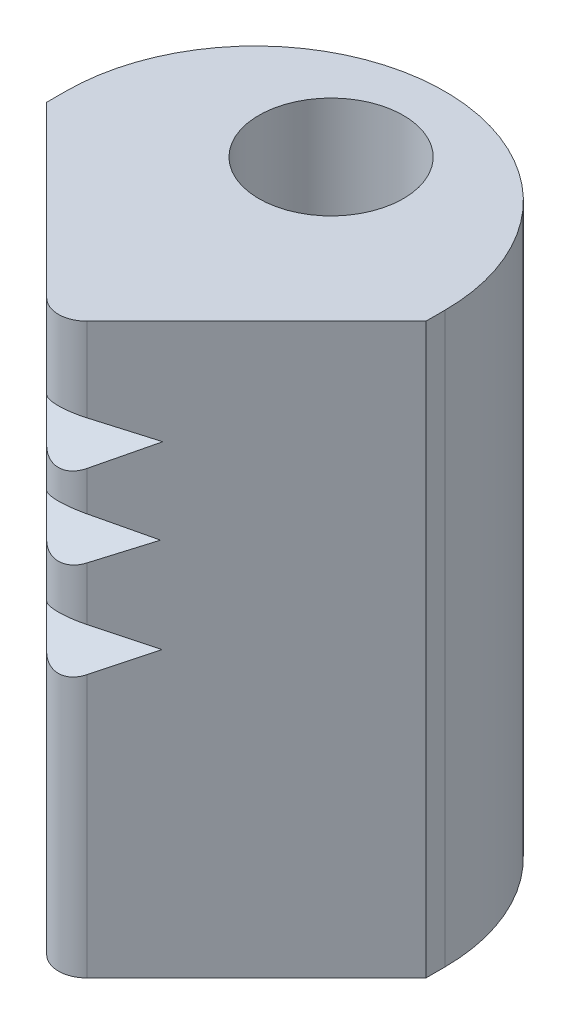
ISO-10303-21;
HEADER;
FILE_DESCRIPTION(('STEP AP214'),'2;1');
FILE_NAME('part.step','',(''),(''),'','','');
FILE_SCHEMA(('AUTOMOTIVE_DESIGN { 1 0 10303 214 1 1 1 1 }'));
ENDSEC;
DATA;
#1=APPLICATION_CONTEXT('core data for automotive mechanical design processes');
#2=APPLICATION_PROTOCOL_DEFINITION('international standard','automotive_design',2000,#1);
#3=PRODUCT_CONTEXT('',#1,'mechanical');
#4=PRODUCT('Part','Part','',(#3));
#5=PRODUCT_RELATED_PRODUCT_CATEGORY('part','',(#4));
#6=PRODUCT_DEFINITION_FORMATION('','',#4);
#7=PRODUCT_DEFINITION_CONTEXT('part definition',#1,'design');
#8=PRODUCT_DEFINITION('design','',#6,#7);
#9=PRODUCT_DEFINITION_SHAPE('','',#8);
#10=(LENGTH_UNIT() NAMED_UNIT(*) SI_UNIT(.MILLI.,.METRE.));
#11=(NAMED_UNIT(*) PLANE_ANGLE_UNIT() SI_UNIT($,.RADIAN.));
#12=(NAMED_UNIT(*) SI_UNIT($,.STERADIAN.) SOLID_ANGLE_UNIT());
#13=UNCERTAINTY_MEASURE_WITH_UNIT(LENGTH_MEASURE(1.E-05),#10,'distance_accuracy_value','');
#14=(GEOMETRIC_REPRESENTATION_CONTEXT(3) GLOBAL_UNCERTAINTY_ASSIGNED_CONTEXT((#13)) GLOBAL_UNIT_ASSIGNED_CONTEXT((#10,
#11,#12)) REPRESENTATION_CONTEXT('',''));
#15=CARTESIAN_POINT('',(0.,0.,0.));
#16=DIRECTION('',(0.,0.,1.));
#17=DIRECTION('',(1.,0.,0.));
#18=AXIS2_PLACEMENT_3D('',#15,#16,#17);
#19=CARTESIAN_POINT('',(-10.,15.,11.9535831344691));
#20=DIRECTION('',(0.,0.866025403784439,-0.5));
#21=DIRECTION('',(0.,0.5,0.866025403784439));
#22=AXIS2_PLACEMENT_3D('',#19,#20,#21);
#23=PLANE('',#22);
#24=DIRECTION('',(0.654653670707977,0.377964473009227,0.654653670707977));
#25=VECTOR('',#24,1.);
#26=CARTESIAN_POINT('',(-9.37234617437055,11.3477230106669,5.62765382562945));
#27=LINE('',#26,#25);
#28=CARTESIAN_POINT('',(-3.04641686553092,15.,11.9535831344691));
#29=VERTEX_POINT('',#28);
#30=CARTESIAN_POINT('',(-1.06066017177982,16.1464771616823,13.9393398282202));
#31=VERTEX_POINT('',#30);
#32=EDGE_CURVE('E36',#29,#31,#27,.T.);
#33=ORIENTED_EDGE('',*,*,#32,.F.);
#34=DIRECTION('',(1.,0.,0.));
#35=VECTOR('',#34,1.);
#36=CARTESIAN_POINT('',(-10.,15.,11.9535831344691));
#37=LINE('',#36,#35);
#38=CARTESIAN_POINT('',(3.04641686553093,15.,11.9535831344691));
#39=VERTEX_POINT('',#38);
#40=EDGE_CURVE('E11',#29,#39,#37,.T.);
#41=ORIENTED_EDGE('',*,*,#40,.T.);
#42=DIRECTION('',(0.654653670707977,-0.377964473009228,-0.654653670707977));
#43=VECTOR('',#42,1.);
#44=CARTESIAN_POINT('',(1.25548624799048,16.0339942741369,13.7445137520095));
#45=LINE('',#44,#43);
#46=CARTESIAN_POINT('',(1.06066017177982,16.1464771616823,13.9393398282202));
#47=VERTEX_POINT('',#46);
#48=EDGE_CURVE('E247',#47,#39,#45,.T.);
#49=ORIENTED_EDGE('',*,*,#48,.F.);
#50=CARTESIAN_POINT('',(0.,15.5341047259865,12.8786796564404));
#51=DIRECTION('',(0.,0.866025403784439,-0.5));
#52=DIRECTION('',(0.,0.5,0.866025403784439));
#53=AXIS2_PLACEMENT_3D('',#50,#51,#52);
#54=ELLIPSE('',#53,1.73205080756887,1.5);
#55=EDGE_CURVE('E226',#31,#47,#54,.T.);
#56=ORIENTED_EDGE('',*,*,#55,.F.);
#57=EDGE_LOOP('',(#33,#41,#49,#56));
#58=FACE_BOUND('',#57,.T.);
#59=ADVANCED_FACE('F17',(#58),#23,.F.);
#60=CARTESIAN_POINT('',(-10.,13.2802842574765,14.9322181750957));
#61=DIRECTION('',(0.,-0.866025403784439,-0.5));
#62=DIRECTION('',(0.,0.5,-0.866025403784439));
#63=AXIS2_PLACEMENT_3D('',#60,#61,#62);
#64=PLANE('',#63);
#65=DIRECTION('',(-0.654653670707977,0.377964473009228,-0.654653670707977));
#66=VECTOR('',#65,1.);
#67=CARTESIAN_POINT('',(-4.80977014654392,16.0180724914692,10.1902298534561));
#68=LINE('',#67,#66);
#69=CARTESIAN_POINT('',(-1.06066017177982,13.8535228383177,13.9393398282202));
#70=VERTEX_POINT('',#69);
#71=EDGE_CURVE('E167',#70,#29,#68,.T.);
#72=ORIENTED_EDGE('',*,*,#71,.F.);
#73=CARTESIAN_POINT('',(0.,14.4658952740135,12.8786796564404));
#74=DIRECTION('',(0.,-0.866025403784439,-0.5));
#75=DIRECTION('',(0.,-0.5,0.866025403784439));
#76=AXIS2_PLACEMENT_3D('',#73,#74,#75);
#77=ELLIPSE('',#76,1.73205080756887,1.5);
#78=CARTESIAN_POINT('',(1.06066017177982,13.8535228383177,13.9393398282202));
#79=VERTEX_POINT('',#78);
#80=EDGE_CURVE('E273',#79,#70,#77,.T.);
#81=ORIENTED_EDGE('',*,*,#80,.F.);
#82=DIRECTION('',(-0.654653670707977,-0.377964473009228,0.654653670707977));
#83=VECTOR('',#82,1.);
#84=CARTESIAN_POINT('',(-3.30708977983616,11.3318012279992,18.3070897798362));
#85=LINE('',#84,#83);
#86=EDGE_CURVE('E231',#39,#79,#85,.T.);
#87=ORIENTED_EDGE('',*,*,#86,.F.);
#88=ORIENTED_EDGE('',*,*,#40,.F.);
#89=EDGE_LOOP('',(#72,#81,#87,#88));
#90=FACE_BOUND('',#89,.T.);
#91=ADVANCED_FACE('F19',(#90),#64,.F.);
#92=CARTESIAN_POINT('',(-10.,20.0000002980232,12.0000001788139));
#93=DIRECTION('',(0.,0.850328406941422,-0.526252411251923));
#94=DIRECTION('',(0.,0.526252411251923,0.850328406941422));
#95=AXIS2_PLACEMENT_3D('',#92,#93,#94);
#96=PLANE('',#95);
#97=DIRECTION('',(0.647793653966395,0.400907425426037,0.647793653966395));
#98=VECTOR('',#97,1.);
#99=CARTESIAN_POINT('',(-10.0032373228813,15.665827063598,4.9967626771187));
#100=LINE('',#99,#98);
#101=CARTESIAN_POINT('',(-2.99999982118607,20.0000002980232,12.0000001788139));
#102=VERTEX_POINT('',#101);
#103=CARTESIAN_POINT('',(-1.06066017177982,21.2002214812805,13.9393398282202));
#104=VERTEX_POINT('',#103);
#105=EDGE_CURVE('E125',#102,#104,#100,.T.);
#106=ORIENTED_EDGE('',*,*,#105,.F.);
#107=DIRECTION('',(1.,0.,0.));
#108=VECTOR('',#107,1.);
#109=CARTESIAN_POINT('',(-10.,20.0000002980232,12.0000001788139));
#110=LINE('',#109,#108);
#111=CARTESIAN_POINT('',(2.99999982118607,20.0000002980232,12.0000001788139));
#112=VERTEX_POINT('',#111);
#113=EDGE_CURVE('E28',#102,#112,#110,.T.);
#114=ORIENTED_EDGE('',*,*,#113,.T.);
#115=DIRECTION('',(0.647793653966395,-0.400907425426037,-0.647793653966395));
#116=VECTOR('',#115,1.);
#117=CARTESIAN_POINT('',(2.05559680795799,20.5844737306968,12.944403192042));
#118=LINE('',#117,#116);
#119=CARTESIAN_POINT('',(1.06066017177982,21.2002214812805,13.9393398282202));
#120=VERTEX_POINT('',#119);
#121=EDGE_CURVE('E139',#120,#112,#118,.T.);
#122=ORIENTED_EDGE('',*,*,#121,.F.);
#123=CARTESIAN_POINT('',(0.,20.5437986588021,12.8786796564404));
#124=DIRECTION('',(0.,0.850328406941422,-0.526252411251923));
#125=DIRECTION('',(0.,0.526252411251923,0.850328406941422));
#126=AXIS2_PLACEMENT_3D('',#123,#124,#125);
#127=ELLIPSE('',#126,1.76402433195829,1.5);
#128=EDGE_CURVE('E137',#104,#120,#127,.T.);
#129=ORIENTED_EDGE('',*,*,#128,.F.);
#130=EDGE_LOOP('',(#106,#114,#122,#129));
#131=FACE_BOUND('',#130,.T.);
#132=ADVANCED_FACE('F138',(#131),#96,.F.);
#133=CARTESIAN_POINT('',(-10.,18.4094929619204,14.9603996389794));
#134=DIRECTION('',(0.,-0.880912160417692,-0.473279796344862));
#135=DIRECTION('',(0.,0.473279796344862,-0.880912160417692));
#136=AXIS2_PLACEMENT_3D('',#133,#134,#135);
#137=PLANE('',#136);
#138=DIRECTION('',(-0.661013550145006,0.355136837077472,-0.661013550145006));
#139=VECTOR('',#138,1.);
#140=CARTESIAN_POINT('',(-4.40691301195997,20.7558799626752,10.59308698804));
#141=LINE('',#140,#139);
#142=CARTESIAN_POINT('',(-1.06066017177982,18.9580686326921,13.9393398282202));
#143=VERTEX_POINT('',#142);
#144=EDGE_CURVE('E119',#143,#102,#141,.T.);
#145=ORIENTED_EDGE('',*,*,#144,.F.);
#146=CARTESIAN_POINT('',(0.,19.5279200351894,12.8786796564404));
#147=DIRECTION('',(0.,-0.880912160417692,-0.473279796344862));
#148=DIRECTION('',(0.,-0.473279796344862,0.880912160417692));
#149=AXIS2_PLACEMENT_3D('',#146,#147,#148);
#150=ELLIPSE('',#149,1.70278044440749,1.5);
#151=CARTESIAN_POINT('',(1.06066017177982,18.9580686326921,13.9393398282202));
#152=VERTEX_POINT('',#151);
#153=EDGE_CURVE('E227',#152,#143,#150,.T.);
#154=ORIENTED_EDGE('',*,*,#153,.F.);
#155=DIRECTION('',(-0.661013550145006,-0.355136837077473,0.661013550145006));
#156=VECTOR('',#155,1.);
#157=CARTESIAN_POINT('',(-3.86842155452211,16.3098649860479,18.8684215545221));
#158=LINE('',#157,#156);
#159=EDGE_CURVE('E215',#112,#152,#158,.T.);
#160=ORIENTED_EDGE('',*,*,#159,.F.);
#161=ORIENTED_EDGE('',*,*,#113,.F.);
#162=EDGE_LOOP('',(#145,#154,#160,#161));
#163=FACE_BOUND('',#162,.T.);
#164=ADVANCED_FACE('F322',(#163),#137,.F.);
#165=CARTESIAN_POINT('',(-10.,24.495302072441,11.939961089278));
#166=DIRECTION('',(0.,0.878217976496904,-0.478260583529192));
#167=DIRECTION('',(0.,0.478260583529192,0.878217976496904));
#168=AXIS2_PLACEMENT_3D('',#165,#166,#167);
#169=PLANE('',#168);
#170=DIRECTION('',(0.659872955749197,0.359354093536773,0.659872955749197));
#171=VECTOR('',#170,1.);
#172=CARTESIAN_POINT('',(-10.4971255049263,20.4452080530848,4.50287449507367));
#173=LINE('',#172,#171);
#174=CARTESIAN_POINT('',(-3.06003891072198,24.495302072441,11.939961089278));
#175=VERTEX_POINT('',#174);
#176=CARTESIAN_POINT('',(-1.06066017177982,25.5841251983313,13.9393398282202));
#177=VERTEX_POINT('',#176);
#178=EDGE_CURVE('E157',#175,#177,#173,.T.);
#179=ORIENTED_EDGE('',*,*,#178,.F.);
#180=DIRECTION('',(1.,0.,0.));
#181=VECTOR('',#180,1.);
#182=CARTESIAN_POINT('',(-10.,24.495302072441,11.939961089278));
#183=LINE('',#182,#181);
#184=CARTESIAN_POINT('',(3.06003891072198,24.495302072441,11.939961089278));
#185=VERTEX_POINT('',#184);
#186=EDGE_CURVE('E174',#175,#185,#183,.T.);
#187=ORIENTED_EDGE('',*,*,#186,.T.);
#188=DIRECTION('',(0.659872955749197,-0.359354093536773,-0.659872955749197));
#189=VECTOR('',#188,1.);
#190=CARTESIAN_POINT('',(2.25032486726381,24.9362567343586,12.7496751327362));
#191=LINE('',#190,#189);
#192=CARTESIAN_POINT('',(1.06066017177982,25.5841251983313,13.9393398282202));
#193=VERTEX_POINT('',#192);
#194=EDGE_CURVE('E249',#193,#185,#191,.T.);
#195=ORIENTED_EDGE('',*,*,#194,.F.);
#196=CARTESIAN_POINT('',(0.,25.0065101115791,12.8786796564404));
#197=DIRECTION('',(0.,0.878217976496904,-0.478260583529192));
#198=DIRECTION('',(0.,0.478260583529192,0.878217976496904));
#199=AXIS2_PLACEMENT_3D('',#196,#197,#198);
#200=ELLIPSE('',#199,1.70800420868552,1.5);
#201=EDGE_CURVE('E171',#177,#193,#200,.T.);
#202=ORIENTED_EDGE('',*,*,#201,.F.);
#203=EDGE_LOOP('',(#179,#187,#195,#202));
#204=FACE_BOUND('',#203,.T.);
#205=ADVANCED_FACE('F342',(#204),#169,.F.);
#206=CARTESIAN_POINT('',(-10.,22.6890197728805,14.8958609952786));
#207=DIRECTION('',(0.,-0.853294803213502,-0.521428785941888));
#208=DIRECTION('',(0.,0.521428785941888,-0.853294803213502));
#209=AXIS2_PLACEMENT_3D('',#206,#207,#208);
#210=PLANE('',#209);
#211=DIRECTION('',(-0.649102310529465,0.39665146026533,-0.649102310529465));
#212=VECTOR('',#211,1.);
#213=CARTESIAN_POINT('',(-3.43748899209079,24.7259531170046,11.5625110079092));
#214=LINE('',#213,#212);
#215=CARTESIAN_POINT('',(-1.06066017177982,23.2735278104176,13.9393398282202));
#216=VERTEX_POINT('',#215);
#217=EDGE_CURVE('E152',#216,#175,#214,.T.);
#218=ORIENTED_EDGE('',*,*,#217,.F.);
#219=CARTESIAN_POINT('',(0.,23.9216727933535,12.8786796564404));
#220=DIRECTION('',(0.,-0.853294803213502,-0.521428785941888));
#221=DIRECTION('',(0.,-0.521428785941888,0.853294803213502));
#222=AXIS2_PLACEMENT_3D('',#219,#220,#221);
#223=ELLIPSE('',#222,1.75789187318499,1.5);
#224=CARTESIAN_POINT('',(1.06066017177982,23.2735278104176,13.9393398282202));
#225=VERTEX_POINT('',#224);
#226=EDGE_CURVE('E150',#225,#216,#223,.T.);
#227=ORIENTED_EDGE('',*,*,#226,.F.);
#228=DIRECTION('',(-0.649102310529465,-0.39665146026533,0.649102310529465));
#229=VECTOR('',#228,1.);
#230=CARTESIAN_POINT('',(-4.5422952078053,19.8496909251335,19.5422952078053));
#231=LINE('',#230,#229);
#232=EDGE_CURVE('E282',#185,#225,#231,.T.);
#233=ORIENTED_EDGE('',*,*,#232,.F.);
#234=ORIENTED_EDGE('',*,*,#186,.F.);
#235=EDGE_LOOP('',(#218,#227,#233,#234));
#236=FACE_BOUND('',#235,.T.);
#237=ADVANCED_FACE('F345',(#236),#210,.F.);
#238=CARTESIAN_POINT('',(0.,0.,12.8786796564404));
#239=DIRECTION('',(0.,-1.,0.));
#240=DIRECTION('',(-0.707106781186548,0.,0.707106781186547));
#241=AXIS2_PLACEMENT_3D('',#238,#239,#240);
#242=CYLINDRICAL_SURFACE('',#241,1.5);
#243=ORIENTED_EDGE('',*,*,#201,.T.);
#244=DIRECTION('',(0.,1.,0.));
#245=VECTOR('',#244,1.);
#246=CARTESIAN_POINT('',(1.06066017177982,0.,13.9393398282202));
#247=LINE('',#246,#245);
#248=CARTESIAN_POINT('',(1.06066017177982,30.,13.9393398282202));
#249=VERTEX_POINT('',#248);
#250=EDGE_CURVE('E144',#193,#249,#247,.T.);
#251=ORIENTED_EDGE('',*,*,#250,.T.);
#252=CARTESIAN_POINT('',(0.,30.,12.8786796564404));
#253=DIRECTION('',(0.,1.,0.));
#254=DIRECTION('',(-0.707106781186548,0.,0.707106781186547));
#255=AXIS2_PLACEMENT_3D('',#252,#253,#254);
#256=CIRCLE('',#255,1.5);
#257=CARTESIAN_POINT('',(-1.06066017177982,30.,13.9393398282202));
#258=VERTEX_POINT('',#257);
#259=EDGE_CURVE('E190',#258,#249,#256,.T.);
#260=ORIENTED_EDGE('',*,*,#259,.F.);
#261=DIRECTION('',(0.,1.,0.));
#262=VECTOR('',#261,1.);
#263=CARTESIAN_POINT('',(-1.06066017177982,0.,13.9393398282202));
#264=LINE('',#263,#262);
#265=EDGE_CURVE('E166',#177,#258,#264,.T.);
#266=ORIENTED_EDGE('',*,*,#265,.F.);
#267=EDGE_LOOP('',(#243,#251,#260,#266));
#268=FACE_BOUND('',#267,.T.);
#269=ADVANCED_FACE('F188',(#268),#242,.T.);
#270=CARTESIAN_POINT('',(0.,0.,12.8786796564404));
#271=DIRECTION('',(0.,-1.,0.));
#272=DIRECTION('',(-0.707106781186548,0.,0.707106781186547));
#273=AXIS2_PLACEMENT_3D('',#270,#271,#272);
#274=CYLINDRICAL_SURFACE('',#273,1.5);
#275=ORIENTED_EDGE('',*,*,#128,.T.);
#276=DIRECTION('',(0.,1.,0.));
#277=VECTOR('',#276,1.);
#278=CARTESIAN_POINT('',(1.06066017177982,0.,13.9393398282202));
#279=LINE('',#278,#277);
#280=EDGE_CURVE('E145',#120,#225,#279,.T.);
#281=ORIENTED_EDGE('',*,*,#280,.T.);
#282=ORIENTED_EDGE('',*,*,#226,.T.);
#283=DIRECTION('',(0.,1.,0.));
#284=VECTOR('',#283,1.);
#285=CARTESIAN_POINT('',(-1.06066017177982,0.,13.9393398282202));
#286=LINE('',#285,#284);
#287=EDGE_CURVE('E130',#104,#216,#286,.T.);
#288=ORIENTED_EDGE('',*,*,#287,.F.);
#289=EDGE_LOOP('',(#275,#281,#282,#288));
#290=FACE_BOUND('',#289,.T.);
#291=ADVANCED_FACE('F148',(#290),#274,.T.);
#292=CARTESIAN_POINT('',(0.,0.,12.8786796564404));
#293=DIRECTION('',(0.,-1.,0.));
#294=DIRECTION('',(-0.707106781186548,0.,0.707106781186547));
#295=AXIS2_PLACEMENT_3D('',#292,#293,#294);
#296=CYLINDRICAL_SURFACE('',#295,1.5);
#297=ORIENTED_EDGE('',*,*,#80,.T.);
#298=DIRECTION('',(0.,1.,0.));
#299=VECTOR('',#298,1.);
#300=CARTESIAN_POINT('',(-1.06066017177982,0.,13.9393398282202));
#301=LINE('',#300,#299);
#302=CARTESIAN_POINT('',(-1.06066017177982,0.,13.9393398282202));
#303=VERTEX_POINT('',#302);
#304=EDGE_CURVE('E162',#303,#70,#301,.T.);
#305=ORIENTED_EDGE('',*,*,#304,.F.);
#306=CARTESIAN_POINT('',(0.,0.,12.8786796564404));
#307=DIRECTION('',(0.,1.,0.));
#308=DIRECTION('',(-0.707106781186548,0.,0.707106781186547));
#309=AXIS2_PLACEMENT_3D('',#306,#307,#308);
#310=CIRCLE('',#309,1.5);
#311=CARTESIAN_POINT('',(1.06066017177982,0.,13.9393398282202));
#312=VERTEX_POINT('',#311);
#313=EDGE_CURVE('E269',#303,#312,#310,.T.);
#314=ORIENTED_EDGE('',*,*,#313,.T.);
#315=DIRECTION('',(0.,1.,0.));
#316=VECTOR('',#315,1.);
#317=CARTESIAN_POINT('',(1.06066017177982,0.,13.9393398282202));
#318=LINE('',#317,#316);
#319=EDGE_CURVE('E274',#312,#79,#318,.T.);
#320=ORIENTED_EDGE('',*,*,#319,.T.);
#321=EDGE_LOOP('',(#297,#305,#314,#320));
#322=FACE_BOUND('',#321,.T.);
#323=ADVANCED_FACE('F383',(#322),#296,.T.);
#324=CARTESIAN_POINT('',(0.,0.,12.8786796564404));
#325=DIRECTION('',(0.,-1.,0.));
#326=DIRECTION('',(-0.707106781186548,0.,0.707106781186547));
#327=AXIS2_PLACEMENT_3D('',#324,#325,#326);
#328=CYLINDRICAL_SURFACE('',#327,1.5);
#329=ORIENTED_EDGE('',*,*,#55,.T.);
#330=DIRECTION('',(0.,1.,0.));
#331=VECTOR('',#330,1.);
#332=CARTESIAN_POINT('',(1.06066017177982,0.,13.9393398282202));
#333=LINE('',#332,#331);
#334=EDGE_CURVE('E222',#47,#152,#333,.T.);
#335=ORIENTED_EDGE('',*,*,#334,.T.);
#336=ORIENTED_EDGE('',*,*,#153,.T.);
#337=DIRECTION('',(0.,1.,0.));
#338=VECTOR('',#337,1.);
#339=CARTESIAN_POINT('',(-1.06066017177982,0.,13.9393398282202));
#340=LINE('',#339,#338);
#341=EDGE_CURVE('E221',#31,#143,#340,.T.);
#342=ORIENTED_EDGE('',*,*,#341,.F.);
#343=EDGE_LOOP('',(#329,#335,#336,#342));
#344=FACE_BOUND('',#343,.T.);
#345=ADVANCED_FACE('F325',(#344),#328,.T.);
#346=CARTESIAN_POINT('',(1.06066017177982,0.,13.9393398282202));
#347=DIRECTION('',(0.707106781186548,0.,0.707106781186548));
#348=DIRECTION('',(0.707106781186548,0.,-0.707106781186548));
#349=AXIS2_PLACEMENT_3D('',#346,#347,#348);
#350=PLANE('',#349);
#351=ORIENTED_EDGE('',*,*,#48,.T.);
#352=ORIENTED_EDGE('',*,*,#86,.T.);
#353=ORIENTED_EDGE('',*,*,#319,.F.);
#354=DIRECTION('',(0.707106781186548,0.,-0.707106781186548));
#355=VECTOR('',#354,1.);
#356=CARTESIAN_POINT('',(1.06066017177982,0.,13.9393398282202));
#357=LINE('',#356,#355);
#358=CARTESIAN_POINT('',(10.,0.,5.));
#359=VERTEX_POINT('',#358);
#360=EDGE_CURVE('E228',#312,#359,#357,.T.);
#361=ORIENTED_EDGE('',*,*,#360,.T.);
#362=DIRECTION('',(0.,1.,0.));
#363=VECTOR('',#362,1.);
#364=CARTESIAN_POINT('',(10.,0.,5.));
#365=LINE('',#364,#363);
#366=CARTESIAN_POINT('',(10.,30.,5.));
#367=VERTEX_POINT('',#366);
#368=EDGE_CURVE('E198',#359,#367,#365,.T.);
#369=ORIENTED_EDGE('',*,*,#368,.T.);
#370=DIRECTION('',(0.707106781186548,0.,-0.707106781186548));
#371=VECTOR('',#370,1.);
#372=CARTESIAN_POINT('',(1.06066017177982,30.,13.9393398282202));
#373=LINE('',#372,#371);
#374=EDGE_CURVE('E195',#249,#367,#373,.T.);
#375=ORIENTED_EDGE('',*,*,#374,.F.);
#376=ORIENTED_EDGE('',*,*,#250,.F.);
#377=ORIENTED_EDGE('',*,*,#194,.T.);
#378=ORIENTED_EDGE('',*,*,#232,.T.);
#379=ORIENTED_EDGE('',*,*,#280,.F.);
#380=ORIENTED_EDGE('',*,*,#121,.T.);
#381=ORIENTED_EDGE('',*,*,#159,.T.);
#382=ORIENTED_EDGE('',*,*,#334,.F.);
#383=EDGE_LOOP('',(#351,#352,#353,#361,#369,#375,#376,#377,#378,#379,#380,#381,#382));
#384=FACE_BOUND('',#383,.T.);
#385=ADVANCED_FACE('F196',(#384),#350,.T.);
#386=CARTESIAN_POINT('',(0.,30.,-0.31066017177982));
#387=DIRECTION('',(0.,1.,0.));
#388=DIRECTION('',(1.,0.,0.));
#389=AXIS2_PLACEMENT_3D('',#386,#387,#388);
#390=PLANE('',#389);
#391=CARTESIAN_POINT('',(0.,30.,0.));
#392=DIRECTION('',(0.,-1.,0.));
#393=DIRECTION('',(-1.,0.,0.));
#394=AXIS2_PLACEMENT_3D('',#391,#392,#393);
#395=CIRCLE('',#394,3.81);
#396=CARTESIAN_POINT('',(3.81,30.,0.));
#397=VERTEX_POINT('',#396);
#398=EDGE_CURVE('E217',#397,#397,#395,.T.);
#399=ORIENTED_EDGE('',*,*,#398,.T.);
#400=EDGE_LOOP('',(#399));
#401=FACE_BOUND('',#400,.T.);
#402=CARTESIAN_POINT('',(0.,30.,4.));
#403=DIRECTION('',(0.,-1.,0.));
#404=DIRECTION('',(0.707106781186548,0.,-0.707106781186548));
#405=AXIS2_PLACEMENT_3D('',#402,#403,#404);
#406=CIRCLE('',#405,10.);
#407=CARTESIAN_POINT('',(-10.,30.,4.));
#408=VERTEX_POINT('',#407);
#409=CARTESIAN_POINT('',(10.,30.,4.));
#410=VERTEX_POINT('',#409);
#411=EDGE_CURVE('E264',#408,#410,#406,.T.);
#412=ORIENTED_EDGE('',*,*,#411,.F.);
#413=DIRECTION('',(0.,0.,1.));
#414=VECTOR('',#413,1.);
#415=CARTESIAN_POINT('',(-10.,30.,-15.));
#416=LINE('',#415,#414);
#417=CARTESIAN_POINT('',(-10.,30.,5.));
#418=VERTEX_POINT('',#417);
#419=EDGE_CURVE('E234',#408,#418,#416,.T.);
#420=ORIENTED_EDGE('',*,*,#419,.T.);
#421=DIRECTION('',(0.707106781186548,0.,0.707106781186548));
#422=VECTOR('',#421,1.);
#423=CARTESIAN_POINT('',(-1.06066017177982,30.,13.9393398282202));
#424=LINE('',#423,#422);
#425=EDGE_CURVE('E208',#418,#258,#424,.T.);
#426=ORIENTED_EDGE('',*,*,#425,.T.);
#427=ORIENTED_EDGE('',*,*,#259,.T.);
#428=ORIENTED_EDGE('',*,*,#374,.T.);
#429=DIRECTION('',(0.,0.,-1.));
#430=VECTOR('',#429,1.);
#431=CARTESIAN_POINT('',(10.,30.,5.));
#432=LINE('',#431,#430);
#433=EDGE_CURVE('E203',#367,#410,#432,.T.);
#434=ORIENTED_EDGE('',*,*,#433,.T.);
#435=EDGE_LOOP('',(#412,#420,#426,#427,#428,#434));
#436=FACE_BOUND('',#435,.T.);
#437=ADVANCED_FACE('F369',(#401,#436),#390,.T.);
#438=CARTESIAN_POINT('',(0.,0.,4.));
#439=DIRECTION('',(0.,1.,0.));
#440=DIRECTION('',(-0.707106781186548,0.,-0.707106781186548));
#441=AXIS2_PLACEMENT_3D('',#438,#439,#440);
#442=CYLINDRICAL_SURFACE('',#441,10.);
#443=CARTESIAN_POINT('',(0.,0.,4.));
#444=DIRECTION('',(0.,1.,0.));
#445=DIRECTION('',(0.707106781186548,0.,-0.707106781186548));
#446=AXIS2_PLACEMENT_3D('',#443,#444,#445);
#447=CIRCLE('',#446,10.);
#448=CARTESIAN_POINT('',(10.,0.,4.));
#449=VERTEX_POINT('',#448);
#450=CARTESIAN_POINT('',(-10.,0.,4.));
#451=VERTEX_POINT('',#450);
#452=EDGE_CURVE('E210',#449,#451,#447,.T.);
#453=ORIENTED_EDGE('',*,*,#452,.T.);
#454=DIRECTION('',(0.,1.,0.));
#455=VECTOR('',#454,1.);
#456=CARTESIAN_POINT('',(-10.,0.,4.));
#457=LINE('',#456,#455);
#458=EDGE_CURVE('E261',#451,#408,#457,.T.);
#459=ORIENTED_EDGE('',*,*,#458,.T.);
#460=ORIENTED_EDGE('',*,*,#411,.T.);
#461=DIRECTION('',(0.,-1.,0.));
#462=VECTOR('',#461,1.);
#463=CARTESIAN_POINT('',(10.,0.,4.));
#464=LINE('',#463,#462);
#465=EDGE_CURVE('E279',#410,#449,#464,.T.);
#466=ORIENTED_EDGE('',*,*,#465,.T.);
#467=EDGE_LOOP('',(#453,#459,#460,#466));
#468=FACE_BOUND('',#467,.T.);
#469=ADVANCED_FACE('F372',(#468),#442,.T.);
#470=CARTESIAN_POINT('',(0.,0.,-0.31066017177982));
#471=DIRECTION('',(0.,1.,0.));
#472=DIRECTION('',(1.,0.,0.));
#473=AXIS2_PLACEMENT_3D('',#470,#471,#472);
#474=PLANE('',#473);
#475=ORIENTED_EDGE('',*,*,#452,.F.);
#476=DIRECTION('',(0.,0.,-1.));
#477=VECTOR('',#476,1.);
#478=CARTESIAN_POINT('',(10.,0.,5.));
#479=LINE('',#478,#477);
#480=EDGE_CURVE('E168',#359,#449,#479,.T.);
#481=ORIENTED_EDGE('',*,*,#480,.F.);
#482=ORIENTED_EDGE('',*,*,#360,.F.);
#483=ORIENTED_EDGE('',*,*,#313,.F.);
#484=DIRECTION('',(-0.707106781186548,0.,-0.707106781186548));
#485=VECTOR('',#484,1.);
#486=CARTESIAN_POINT('',(-1.06066017177982,0.,13.9393398282202));
#487=LINE('',#486,#485);
#488=CARTESIAN_POINT('',(-10.,0.,5.));
#489=VERTEX_POINT('',#488);
#490=EDGE_CURVE('E275',#303,#489,#487,.T.);
#491=ORIENTED_EDGE('',*,*,#490,.T.);
#492=DIRECTION('',(0.,0.,1.));
#493=VECTOR('',#492,1.);
#494=CARTESIAN_POINT('',(-10.,0.,-15.));
#495=LINE('',#494,#493);
#496=EDGE_CURVE('E21',#451,#489,#495,.T.);
#497=ORIENTED_EDGE('',*,*,#496,.F.);
#498=EDGE_LOOP('',(#475,#481,#482,#483,#491,#497));
#499=FACE_BOUND('',#498,.T.);
#500=CARTESIAN_POINT('',(0.,0.,0.));
#501=DIRECTION('',(0.,-1.,0.));
#502=DIRECTION('',(1.,0.,0.));
#503=AXIS2_PLACEMENT_3D('',#500,#501,#502);
#504=CIRCLE('',#503,2.032);
#505=CARTESIAN_POINT('',(-2.032,0.,0.));
#506=VERTEX_POINT('',#505);
#507=EDGE_CURVE('E238',#506,#506,#504,.T.);
#508=ORIENTED_EDGE('',*,*,#507,.F.);
#509=EDGE_LOOP('',(#508));
#510=FACE_BOUND('',#509,.T.);
#511=ADVANCED_FACE('F386',(#499,#510),#474,.F.);
#512=CARTESIAN_POINT('',(-10.,0.,-15.));
#513=DIRECTION('',(-1.,0.,0.));
#514=DIRECTION('',(0.,0.,1.));
#515=AXIS2_PLACEMENT_3D('',#512,#513,#514);
#516=PLANE('',#515);
#517=ORIENTED_EDGE('',*,*,#458,.F.);
#518=ORIENTED_EDGE('',*,*,#496,.T.);
#519=DIRECTION('',(0.,1.,0.));
#520=VECTOR('',#519,1.);
#521=CARTESIAN_POINT('',(-10.,0.,5.));
#522=LINE('',#521,#520);
#523=EDGE_CURVE('E256',#489,#418,#522,.T.);
#524=ORIENTED_EDGE('',*,*,#523,.T.);
#525=ORIENTED_EDGE('',*,*,#419,.F.);
#526=EDGE_LOOP('',(#517,#518,#524,#525));
#527=FACE_BOUND('',#526,.T.);
#528=ADVANCED_FACE('F388',(#527),#516,.T.);
#529=CARTESIAN_POINT('',(0.,30.,0.));
#530=DIRECTION('',(0.,1.,0.));
#531=DIRECTION('',(-1.,0.,0.));
#532=AXIS2_PLACEMENT_3D('',#529,#530,#531);
#533=CYLINDRICAL_SURFACE('',#532,3.81);
#534=CARTESIAN_POINT('',(0.,10.,0.));
#535=DIRECTION('',(0.,-1.,0.));
#536=DIRECTION('',(-1.,0.,0.));
#537=AXIS2_PLACEMENT_3D('',#534,#535,#536);
#538=CIRCLE('',#537,3.81);
#539=CARTESIAN_POINT('',(3.81,10.,0.));
#540=VERTEX_POINT('',#539);
#541=EDGE_CURVE('E259',#540,#540,#538,.T.);
#542=ORIENTED_EDGE('',*,*,#541,.T.);
#543=EDGE_LOOP('',(#542));
#544=FACE_BOUND('',#543,.T.);
#545=ORIENTED_EDGE('',*,*,#398,.F.);
#546=EDGE_LOOP('',(#545));
#547=FACE_BOUND('',#546,.T.);
#548=ADVANCED_FACE('F394',(#544,#547),#533,.F.);
#549=CARTESIAN_POINT('',(0.,10.,0.));
#550=DIRECTION('',(0.,1.,0.));
#551=DIRECTION('',(-1.,0.,0.));
#552=AXIS2_PLACEMENT_3D('',#549,#550,#551);
#553=PLANE('',#552);
#554=CARTESIAN_POINT('',(0.,10.,0.));
#555=DIRECTION('',(0.,1.,0.));
#556=DIRECTION('',(1.,0.,0.));
#557=AXIS2_PLACEMENT_3D('',#554,#555,#556);
#558=CIRCLE('',#557,2.032);
#559=CARTESIAN_POINT('',(2.032,10.,0.));
#560=VERTEX_POINT('',#559);
#561=EDGE_CURVE('E242',#560,#560,#558,.T.);
#562=ORIENTED_EDGE('',*,*,#561,.F.);
#563=EDGE_LOOP('',(#562));
#564=FACE_BOUND('',#563,.T.);
#565=ORIENTED_EDGE('',*,*,#541,.F.);
#566=EDGE_LOOP('',(#565));
#567=FACE_BOUND('',#566,.T.);
#568=ADVANCED_FACE('F365',(#564,#567),#553,.T.);
#569=CARTESIAN_POINT('',(0.,0.,0.));
#570=DIRECTION('',(0.,-1.,0.));
#571=DIRECTION('',(1.,0.,0.));
#572=AXIS2_PLACEMENT_3D('',#569,#570,#571);
#573=CYLINDRICAL_SURFACE('',#572,2.032);
#574=ORIENTED_EDGE('',*,*,#561,.T.);
#575=EDGE_LOOP('',(#574));
#576=FACE_BOUND('',#575,.T.);
#577=ORIENTED_EDGE('',*,*,#507,.T.);
#578=EDGE_LOOP('',(#577));
#579=FACE_BOUND('',#578,.T.);
#580=ADVANCED_FACE('F374',(#576,#579),#573,.F.);
#581=CARTESIAN_POINT('',(-10.,0.,5.));
#582=DIRECTION('',(-0.707106781186548,0.,0.707106781186548));
#583=DIRECTION('',(0.707106781186548,0.,0.707106781186548));
#584=AXIS2_PLACEMENT_3D('',#581,#582,#583);
#585=PLANE('',#584);
#586=ORIENTED_EDGE('',*,*,#32,.T.);
#587=ORIENTED_EDGE('',*,*,#341,.T.);
#588=ORIENTED_EDGE('',*,*,#144,.T.);
#589=ORIENTED_EDGE('',*,*,#105,.T.);
#590=ORIENTED_EDGE('',*,*,#287,.T.);
#591=ORIENTED_EDGE('',*,*,#217,.T.);
#592=ORIENTED_EDGE('',*,*,#178,.T.);
#593=ORIENTED_EDGE('',*,*,#265,.T.);
#594=ORIENTED_EDGE('',*,*,#425,.F.);
#595=ORIENTED_EDGE('',*,*,#523,.F.);
#596=ORIENTED_EDGE('',*,*,#490,.F.);
#597=ORIENTED_EDGE('',*,*,#304,.T.);
#598=ORIENTED_EDGE('',*,*,#71,.T.);
#599=EDGE_LOOP('',(#586,#587,#588,#589,#590,#591,#592,#593,#594,#595,#596,#597,#598));
#600=FACE_BOUND('',#599,.T.);
#601=ADVANCED_FACE('F127',(#600),#585,.T.);
#602=CARTESIAN_POINT('',(10.,0.,5.));
#603=DIRECTION('',(1.,0.,0.));
#604=DIRECTION('',(0.,0.,-1.));
#605=AXIS2_PLACEMENT_3D('',#602,#603,#604);
#606=PLANE('',#605);
#607=ORIENTED_EDGE('',*,*,#465,.F.);
#608=ORIENTED_EDGE('',*,*,#433,.F.);
#609=ORIENTED_EDGE('',*,*,#368,.F.);
#610=ORIENTED_EDGE('',*,*,#480,.T.);
#611=EDGE_LOOP('',(#607,#608,#609,#610));
#612=FACE_BOUND('',#611,.T.);
#613=ADVANCED_FACE('F380',(#612),#606,.T.);
#614=CLOSED_SHELL('',(#59,#91,#132,#164,#205,#237,#269,#291,#323,#345,#385,#437,#469,#511,#528,
#548,#568,#580,#601,#613));
#615=MANIFOLD_SOLID_BREP('B1',#614);
#616=ADVANCED_BREP_SHAPE_REPRESENTATION('',(#18,#615),#14);
#617=SHAPE_DEFINITION_REPRESENTATION(#9,#616);
ENDSEC;
END-ISO-10303-21;
